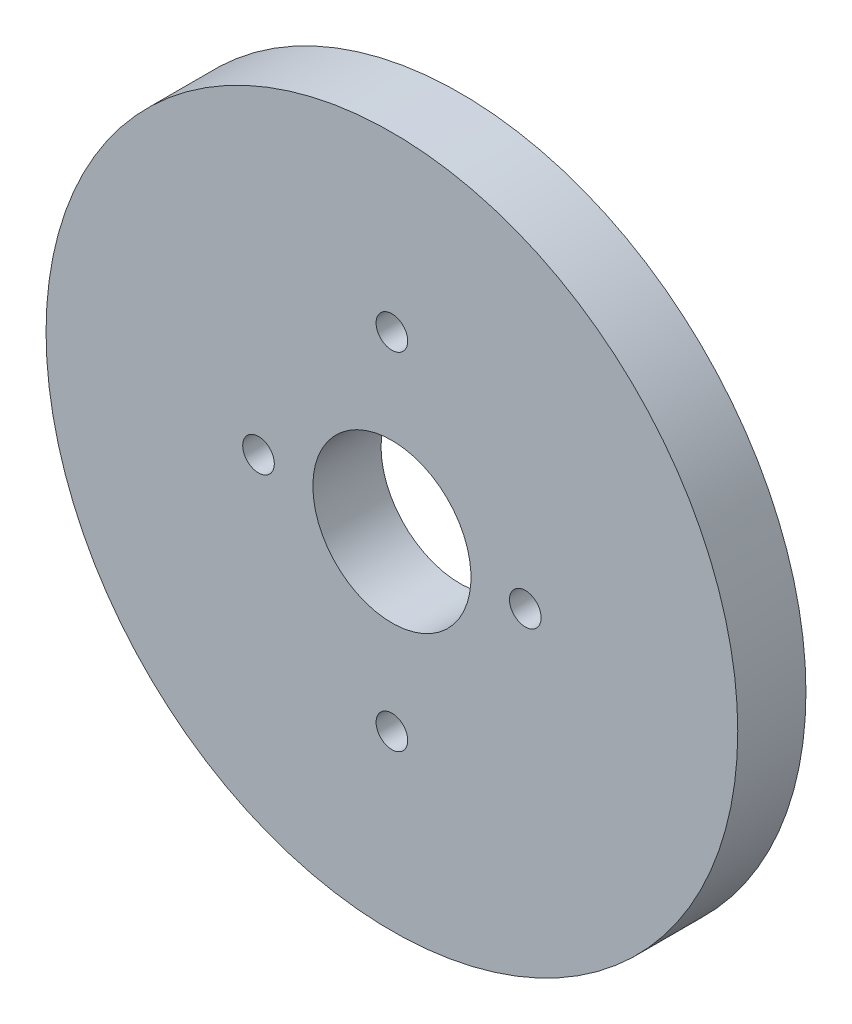
ISO-10303-21;
HEADER;
FILE_DESCRIPTION(('STEP AP214'),'2;1');
FILE_NAME('part.step','',(''),(''),'','','');
FILE_SCHEMA(('AUTOMOTIVE_DESIGN { 1 0 10303 214 1 1 1 1 }'));
ENDSEC;
DATA;
#1=APPLICATION_CONTEXT('core data for automotive mechanical design processes');
#2=APPLICATION_PROTOCOL_DEFINITION('international standard','automotive_design',2000,#1);
#3=PRODUCT_CONTEXT('',#1,'mechanical');
#4=PRODUCT('Part','Part','',(#3));
#5=PRODUCT_RELATED_PRODUCT_CATEGORY('part','',(#4));
#6=PRODUCT_DEFINITION_FORMATION('','',#4);
#7=PRODUCT_DEFINITION_CONTEXT('part definition',#1,'design');
#8=PRODUCT_DEFINITION('design','',#6,#7);
#9=PRODUCT_DEFINITION_SHAPE('','',#8);
#10=(LENGTH_UNIT() NAMED_UNIT(*) SI_UNIT(.MILLI.,.METRE.));
#11=(NAMED_UNIT(*) PLANE_ANGLE_UNIT() SI_UNIT($,.RADIAN.));
#12=(NAMED_UNIT(*) SI_UNIT($,.STERADIAN.) SOLID_ANGLE_UNIT());
#13=UNCERTAINTY_MEASURE_WITH_UNIT(LENGTH_MEASURE(1.E-05),#10,'distance_accuracy_value','');
#14=(GEOMETRIC_REPRESENTATION_CONTEXT(3) GLOBAL_UNCERTAINTY_ASSIGNED_CONTEXT((#13)) GLOBAL_UNIT_ASSIGNED_CONTEXT((#10,
#11,#12)) REPRESENTATION_CONTEXT('',''));
#15=CARTESIAN_POINT('',(0.,0.,0.));
#16=DIRECTION('',(0.,0.,1.));
#17=DIRECTION('',(1.,0.,0.));
#18=AXIS2_PLACEMENT_3D('',#15,#16,#17);
#19=CARTESIAN_POINT('',(0.,0.,3.45));
#20=DIRECTION('',(0.,0.,1.));
#21=DIRECTION('',(1.,0.,0.));
#22=AXIS2_PLACEMENT_3D('',#19,#20,#21);
#23=PLANE('',#22);
#24=CARTESIAN_POINT('',(0.,-8.75,3.45));
#25=DIRECTION('',(0.,0.,1.));
#26=DIRECTION('',(-1.,0.,0.));
#27=AXIS2_PLACEMENT_3D('',#24,#25,#26);
#28=CIRCLE('',#27,0.8);
#29=CARTESIAN_POINT('',(-0.8,-8.75,3.45));
#30=VERTEX_POINT('',#29);
#31=EDGE_CURVE('E58',#30,#30,#28,.T.);
#32=ORIENTED_EDGE('',*,*,#31,.F.);
#33=EDGE_LOOP('',(#32));
#34=FACE_BOUND('',#33,.T.);
#35=CARTESIAN_POINT('',(6.75,0.,3.45));
#36=DIRECTION('',(0.,0.,1.));
#37=DIRECTION('',(1.,0.,0.));
#38=AXIS2_PLACEMENT_3D('',#35,#36,#37);
#39=CIRCLE('',#38,0.8);
#40=CARTESIAN_POINT('',(5.95,0.,3.45));
#41=VERTEX_POINT('',#40);
#42=EDGE_CURVE('E46',#41,#41,#39,.T.);
#43=ORIENTED_EDGE('',*,*,#42,.F.);
#44=EDGE_LOOP('',(#43));
#45=FACE_BOUND('',#44,.T.);
#46=CARTESIAN_POINT('',(0.,0.,3.45));
#47=DIRECTION('',(0.,0.,1.));
#48=DIRECTION('',(1.,0.,0.));
#49=AXIS2_PLACEMENT_3D('',#46,#47,#48);
#50=CIRCLE('',#49,17.5);
#51=CARTESIAN_POINT('',(-17.5,0.,3.45));
#52=VERTEX_POINT('',#51);
#53=EDGE_CURVE('E10',#52,#52,#50,.T.);
#54=ORIENTED_EDGE('',*,*,#53,.T.);
#55=EDGE_LOOP('',(#54));
#56=FACE_BOUND('',#55,.T.);
#57=CARTESIAN_POINT('',(0.,0.,3.45));
#58=DIRECTION('',(0.,0.,1.));
#59=DIRECTION('',(1.,0.,0.));
#60=AXIS2_PLACEMENT_3D('',#57,#58,#59);
#61=CIRCLE('',#60,4.);
#62=CARTESIAN_POINT('',(-4.,0.,3.45));
#63=VERTEX_POINT('',#62);
#64=EDGE_CURVE('E41',#63,#63,#61,.T.);
#65=ORIENTED_EDGE('',*,*,#64,.F.);
#66=EDGE_LOOP('',(#65));
#67=FACE_BOUND('',#66,.T.);
#68=CARTESIAN_POINT('',(0.,8.75,3.45));
#69=DIRECTION('',(0.,0.,1.));
#70=DIRECTION('',(1.,0.,0.));
#71=AXIS2_PLACEMENT_3D('',#68,#69,#70);
#72=CIRCLE('',#71,0.8);
#73=CARTESIAN_POINT('',(-0.8,8.75,3.45));
#74=VERTEX_POINT('',#73);
#75=EDGE_CURVE('E52',#74,#74,#72,.T.);
#76=ORIENTED_EDGE('',*,*,#75,.F.);
#77=EDGE_LOOP('',(#76));
#78=FACE_BOUND('',#77,.T.);
#79=CARTESIAN_POINT('',(-6.75,0.,3.45));
#80=DIRECTION('',(0.,0.,1.));
#81=DIRECTION('',(-1.,0.,0.));
#82=AXIS2_PLACEMENT_3D('',#79,#80,#81);
#83=CIRCLE('',#82,0.8);
#84=CARTESIAN_POINT('',(-7.55,0.,3.45));
#85=VERTEX_POINT('',#84);
#86=EDGE_CURVE('E64',#85,#85,#83,.T.);
#87=ORIENTED_EDGE('',*,*,#86,.F.);
#88=EDGE_LOOP('',(#87));
#89=FACE_BOUND('',#88,.T.);
#90=ADVANCED_FACE('F30',(#34,#45,#56,#67,#78,#89),#23,.T.);
#91=CARTESIAN_POINT('',(0.,0.,0.));
#92=DIRECTION('',(0.,0.,1.));
#93=DIRECTION('',(1.,0.,0.));
#94=AXIS2_PLACEMENT_3D('',#91,#92,#93);
#95=PLANE('',#94);
#96=CARTESIAN_POINT('',(0.,0.,0.));
#97=DIRECTION('',(0.,0.,1.));
#98=DIRECTION('',(1.,0.,0.));
#99=AXIS2_PLACEMENT_3D('',#96,#97,#98);
#100=CIRCLE('',#99,17.5);
#101=CARTESIAN_POINT('',(-17.5,0.,0.));
#102=VERTEX_POINT('',#101);
#103=EDGE_CURVE('E34',#102,#102,#100,.T.);
#104=ORIENTED_EDGE('',*,*,#103,.F.);
#105=EDGE_LOOP('',(#104));
#106=FACE_BOUND('',#105,.T.);
#107=CARTESIAN_POINT('',(0.,0.,0.));
#108=DIRECTION('',(0.,0.,1.));
#109=DIRECTION('',(1.,0.,0.));
#110=AXIS2_PLACEMENT_3D('',#107,#108,#109);
#111=CIRCLE('',#110,4.);
#112=CARTESIAN_POINT('',(-4.,0.,0.));
#113=VERTEX_POINT('',#112);
#114=EDGE_CURVE('E43',#113,#113,#111,.T.);
#115=ORIENTED_EDGE('',*,*,#114,.T.);
#116=EDGE_LOOP('',(#115));
#117=FACE_BOUND('',#116,.T.);
#118=CARTESIAN_POINT('',(6.75,0.,0.));
#119=DIRECTION('',(0.,0.,1.));
#120=DIRECTION('',(1.,0.,0.));
#121=AXIS2_PLACEMENT_3D('',#118,#119,#120);
#122=CIRCLE('',#121,0.8);
#123=CARTESIAN_POINT('',(5.95,0.,0.));
#124=VERTEX_POINT('',#123);
#125=EDGE_CURVE('E49',#124,#124,#122,.T.);
#126=ORIENTED_EDGE('',*,*,#125,.T.);
#127=EDGE_LOOP('',(#126));
#128=FACE_BOUND('',#127,.T.);
#129=CARTESIAN_POINT('',(0.,8.75,0.));
#130=DIRECTION('',(0.,0.,1.));
#131=DIRECTION('',(1.,0.,0.));
#132=AXIS2_PLACEMENT_3D('',#129,#130,#131);
#133=CIRCLE('',#132,0.8);
#134=CARTESIAN_POINT('',(-0.8,8.75,0.));
#135=VERTEX_POINT('',#134);
#136=EDGE_CURVE('E55',#135,#135,#133,.T.);
#137=ORIENTED_EDGE('',*,*,#136,.T.);
#138=EDGE_LOOP('',(#137));
#139=FACE_BOUND('',#138,.T.);
#140=CARTESIAN_POINT('',(0.,-8.75,0.));
#141=DIRECTION('',(0.,0.,1.));
#142=DIRECTION('',(-1.,0.,0.));
#143=AXIS2_PLACEMENT_3D('',#140,#141,#142);
#144=CIRCLE('',#143,0.8);
#145=CARTESIAN_POINT('',(-0.8,-8.75,0.));
#146=VERTEX_POINT('',#145);
#147=EDGE_CURVE('E61',#146,#146,#144,.T.);
#148=ORIENTED_EDGE('',*,*,#147,.T.);
#149=EDGE_LOOP('',(#148));
#150=FACE_BOUND('',#149,.T.);
#151=CARTESIAN_POINT('',(-6.75,0.,0.));
#152=DIRECTION('',(0.,0.,1.));
#153=DIRECTION('',(-1.,0.,0.));
#154=AXIS2_PLACEMENT_3D('',#151,#152,#153);
#155=CIRCLE('',#154,0.8);
#156=CARTESIAN_POINT('',(-7.55,0.,0.));
#157=VERTEX_POINT('',#156);
#158=EDGE_CURVE('E67',#157,#157,#155,.T.);
#159=ORIENTED_EDGE('',*,*,#158,.T.);
#160=EDGE_LOOP('',(#159));
#161=FACE_BOUND('',#160,.T.);
#162=ADVANCED_FACE('F77',(#106,#117,#128,#139,#150,#161),#95,.F.);
#163=CARTESIAN_POINT('',(0.,0.,3.45));
#164=DIRECTION('',(0.,0.,-1.));
#165=DIRECTION('',(-1.,0.,0.));
#166=AXIS2_PLACEMENT_3D('',#163,#164,#165);
#167=CYLINDRICAL_SURFACE('',#166,17.5);
#168=CARTESIAN_POINT('',(-17.5,0.,3.45));
#169=CARTESIAN_POINT('',(-17.5,0.,3.4140625));
#170=CARTESIAN_POINT('',(-17.5,0.,3.378125));
#171=CARTESIAN_POINT('',(-17.5,0.,3.30625));
#172=CARTESIAN_POINT('',(-17.5,0.,3.2703125));
#173=CARTESIAN_POINT('',(-17.5,0.,3.1984375));
#174=CARTESIAN_POINT('',(-17.5,0.,3.1625));
#175=CARTESIAN_POINT('',(-17.5,0.,3.090625));
#176=CARTESIAN_POINT('',(-17.5,0.,3.0546875));
#177=CARTESIAN_POINT('',(-17.5,0.,2.9828125));
#178=CARTESIAN_POINT('',(-17.5,0.,2.946875));
#179=CARTESIAN_POINT('',(-17.5,0.,2.875));
#180=CARTESIAN_POINT('',(-17.5,0.,2.8390625));
#181=CARTESIAN_POINT('',(-17.5,0.,2.7671875));
#182=CARTESIAN_POINT('',(-17.5,0.,2.73125));
#183=CARTESIAN_POINT('',(-17.5,0.,2.659375));
#184=CARTESIAN_POINT('',(-17.5,0.,2.6234375));
#185=CARTESIAN_POINT('',(-17.5,0.,2.5515625));
#186=CARTESIAN_POINT('',(-17.5,0.,2.515625));
#187=CARTESIAN_POINT('',(-17.5,0.,2.44375));
#188=CARTESIAN_POINT('',(-17.5,0.,2.4078125));
#189=CARTESIAN_POINT('',(-17.5,0.,2.3359375));
#190=CARTESIAN_POINT('',(-17.5,0.,2.3));
#191=CARTESIAN_POINT('',(-17.5,0.,2.228125));
#192=CARTESIAN_POINT('',(-17.5,0.,2.1921875));
#193=CARTESIAN_POINT('',(-17.5,0.,2.1203125));
#194=CARTESIAN_POINT('',(-17.5,0.,2.084375));
#195=CARTESIAN_POINT('',(-17.5,0.,2.0125));
#196=CARTESIAN_POINT('',(-17.5,0.,1.9765625));
#197=CARTESIAN_POINT('',(-17.5,0.,1.9046875));
#198=CARTESIAN_POINT('',(-17.5,0.,1.86875));
#199=CARTESIAN_POINT('',(-17.5,0.,1.796875));
#200=CARTESIAN_POINT('',(-17.5,0.,1.7609375));
#201=CARTESIAN_POINT('',(-17.5,0.,1.6890625));
#202=CARTESIAN_POINT('',(-17.5,0.,1.653125));
#203=CARTESIAN_POINT('',(-17.5,0.,1.58125));
#204=CARTESIAN_POINT('',(-17.5,0.,1.5453125));
#205=CARTESIAN_POINT('',(-17.5,0.,1.4734375));
#206=CARTESIAN_POINT('',(-17.5,0.,1.4375));
#207=CARTESIAN_POINT('',(-17.5,0.,1.365625));
#208=CARTESIAN_POINT('',(-17.5,0.,1.3296875));
#209=CARTESIAN_POINT('',(-17.5,0.,1.2578125));
#210=CARTESIAN_POINT('',(-17.5,0.,1.221875));
#211=CARTESIAN_POINT('',(-17.5,0.,1.15));
#212=CARTESIAN_POINT('',(-17.5,0.,1.1140625));
#213=CARTESIAN_POINT('',(-17.5,0.,1.0421875));
#214=CARTESIAN_POINT('',(-17.5,0.,1.00625));
#215=CARTESIAN_POINT('',(-17.5,0.,0.934375));
#216=CARTESIAN_POINT('',(-17.5,0.,0.8984375));
#217=CARTESIAN_POINT('',(-17.5,0.,0.8265625));
#218=CARTESIAN_POINT('',(-17.5,0.,0.790625));
#219=CARTESIAN_POINT('',(-17.5,0.,0.71875));
#220=CARTESIAN_POINT('',(-17.5,0.,0.6828125));
#221=CARTESIAN_POINT('',(-17.5,0.,0.6109375));
#222=CARTESIAN_POINT('',(-17.5,0.,0.575));
#223=CARTESIAN_POINT('',(-17.5,0.,0.503125));
#224=CARTESIAN_POINT('',(-17.5,0.,0.4671875));
#225=CARTESIAN_POINT('',(-17.5,0.,0.3953125));
#226=CARTESIAN_POINT('',(-17.5,0.,0.359375));
#227=CARTESIAN_POINT('',(-17.5,0.,0.2875));
#228=CARTESIAN_POINT('',(-17.5,0.,0.2515625));
#229=CARTESIAN_POINT('',(-17.5,0.,0.1796875));
#230=CARTESIAN_POINT('',(-17.5,0.,0.14375));
#231=CARTESIAN_POINT('',(-17.5,0.,0.0718749999999999));
#232=CARTESIAN_POINT('',(-17.5,0.,0.0359374999999999));
#233=CARTESIAN_POINT('',(-17.5,0.,0.));
#234=B_SPLINE_CURVE_WITH_KNOTS('',3,(#168,#169,#170,#171,#172,#173,#174,#175,#176,#177,#178,
#179,#180,#181,#182,#183,#184,#185,#186,#187,#188,#189,#190,#191,#192,#193,#194,#195,#196,#197,
#198,#199,#200,#201,#202,#203,#204,#205,#206,#207,#208,#209,#210,#211,#212,#213,#214,#215,#216,
#217,#218,#219,#220,#221,#222,#223,#224,#225,#226,#227,#228,#229,#230,#231,#232,#233),
.UNSPECIFIED.,.F.,.F.,(4,2,2,2,2,2,2,2,2,2,2,2,2,2,2,2,2,2,2,2,2,2,2,2,2,2,2,2,2,2,2,2,4),(0.,
0.1078125,0.215625,0.3234375,0.43125,0.5390625,0.646875,0.7546875,0.8625,0.9703125,1.078125,
1.1859375,1.29375,1.4015625,1.509375,1.6171875,1.725,1.8328125,1.940625,2.0484375,2.15625,
2.2640625,2.371875,2.4796875,2.5875,2.6953125,2.803125,2.9109375,3.01875,3.1265625,3.234375,
3.3421875,3.45),.UNSPECIFIED.);
#235=EDGE_CURVE('BSEAM32',#52,#102,#234,.T.);
#236=ORIENTED_EDGE('',*,*,#53,.F.);
#237=ORIENTED_EDGE('',*,*,#103,.T.);
#238=ORIENTED_EDGE('',*,*,#235,.T.);
#239=ORIENTED_EDGE('',*,*,#235,.F.);
#240=EDGE_LOOP('',(#236,#238,#237,#239));
#241=FACE_BOUND('',#240,.T.);
#242=ADVANCED_FACE('F32',(#241),#167,.T.);
#243=CARTESIAN_POINT('',(0.,0.,3.45));
#244=DIRECTION('',(0.,0.,-1.));
#245=DIRECTION('',(-1.,0.,0.));
#246=AXIS2_PLACEMENT_3D('',#243,#244,#245);
#247=CYLINDRICAL_SURFACE('',#246,4.);
#248=CARTESIAN_POINT('',(-4.,0.,3.45));
#249=CARTESIAN_POINT('',(-4.,0.,3.4140625));
#250=CARTESIAN_POINT('',(-4.,0.,3.378125));
#251=CARTESIAN_POINT('',(-4.,0.,3.30625));
#252=CARTESIAN_POINT('',(-4.,0.,3.2703125));
#253=CARTESIAN_POINT('',(-4.,0.,3.1984375));
#254=CARTESIAN_POINT('',(-4.,0.,3.1625));
#255=CARTESIAN_POINT('',(-4.,0.,3.090625));
#256=CARTESIAN_POINT('',(-4.,0.,3.0546875));
#257=CARTESIAN_POINT('',(-4.,0.,2.9828125));
#258=CARTESIAN_POINT('',(-4.,0.,2.946875));
#259=CARTESIAN_POINT('',(-4.,0.,2.875));
#260=CARTESIAN_POINT('',(-4.,0.,2.8390625));
#261=CARTESIAN_POINT('',(-4.,0.,2.7671875));
#262=CARTESIAN_POINT('',(-4.,0.,2.73125));
#263=CARTESIAN_POINT('',(-4.,0.,2.659375));
#264=CARTESIAN_POINT('',(-4.,0.,2.6234375));
#265=CARTESIAN_POINT('',(-4.,0.,2.5515625));
#266=CARTESIAN_POINT('',(-4.,0.,2.515625));
#267=CARTESIAN_POINT('',(-4.,0.,2.44375));
#268=CARTESIAN_POINT('',(-4.,0.,2.4078125));
#269=CARTESIAN_POINT('',(-4.,0.,2.3359375));
#270=CARTESIAN_POINT('',(-4.,0.,2.3));
#271=CARTESIAN_POINT('',(-4.,0.,2.228125));
#272=CARTESIAN_POINT('',(-4.,0.,2.1921875));
#273=CARTESIAN_POINT('',(-4.,0.,2.1203125));
#274=CARTESIAN_POINT('',(-4.,0.,2.084375));
#275=CARTESIAN_POINT('',(-4.,0.,2.0125));
#276=CARTESIAN_POINT('',(-4.,0.,1.9765625));
#277=CARTESIAN_POINT('',(-4.,0.,1.9046875));
#278=CARTESIAN_POINT('',(-4.,0.,1.86875));
#279=CARTESIAN_POINT('',(-4.,0.,1.796875));
#280=CARTESIAN_POINT('',(-4.,0.,1.7609375));
#281=CARTESIAN_POINT('',(-4.,0.,1.6890625));
#282=CARTESIAN_POINT('',(-4.,0.,1.653125));
#283=CARTESIAN_POINT('',(-4.,0.,1.58125));
#284=CARTESIAN_POINT('',(-4.,0.,1.5453125));
#285=CARTESIAN_POINT('',(-4.,0.,1.4734375));
#286=CARTESIAN_POINT('',(-4.,0.,1.4375));
#287=CARTESIAN_POINT('',(-4.,0.,1.365625));
#288=CARTESIAN_POINT('',(-4.,0.,1.3296875));
#289=CARTESIAN_POINT('',(-4.,0.,1.2578125));
#290=CARTESIAN_POINT('',(-4.,0.,1.221875));
#291=CARTESIAN_POINT('',(-4.,0.,1.15));
#292=CARTESIAN_POINT('',(-4.,0.,1.1140625));
#293=CARTESIAN_POINT('',(-4.,0.,1.0421875));
#294=CARTESIAN_POINT('',(-4.,0.,1.00625));
#295=CARTESIAN_POINT('',(-4.,0.,0.934375));
#296=CARTESIAN_POINT('',(-4.,0.,0.8984375));
#297=CARTESIAN_POINT('',(-4.,0.,0.8265625));
#298=CARTESIAN_POINT('',(-4.,0.,0.790625));
#299=CARTESIAN_POINT('',(-4.,0.,0.71875));
#300=CARTESIAN_POINT('',(-4.,0.,0.6828125));
#301=CARTESIAN_POINT('',(-4.,0.,0.6109375));
#302=CARTESIAN_POINT('',(-4.,0.,0.575));
#303=CARTESIAN_POINT('',(-4.,0.,0.503125));
#304=CARTESIAN_POINT('',(-4.,0.,0.4671875));
#305=CARTESIAN_POINT('',(-4.,0.,0.3953125));
#306=CARTESIAN_POINT('',(-4.,0.,0.359375));
#307=CARTESIAN_POINT('',(-4.,0.,0.2875));
#308=CARTESIAN_POINT('',(-4.,0.,0.2515625));
#309=CARTESIAN_POINT('',(-4.,0.,0.1796875));
#310=CARTESIAN_POINT('',(-4.,0.,0.14375));
#311=CARTESIAN_POINT('',(-4.,0.,0.0718749999999999));
#312=CARTESIAN_POINT('',(-4.,0.,0.0359374999999999));
#313=CARTESIAN_POINT('',(-4.,0.,0.));
#314=B_SPLINE_CURVE_WITH_KNOTS('',3,(#248,#249,#250,#251,#252,#253,#254,#255,#256,#257,#258,
#259,#260,#261,#262,#263,#264,#265,#266,#267,#268,#269,#270,#271,#272,#273,#274,#275,#276,#277,
#278,#279,#280,#281,#282,#283,#284,#285,#286,#287,#288,#289,#290,#291,#292,#293,#294,#295,#296,
#297,#298,#299,#300,#301,#302,#303,#304,#305,#306,#307,#308,#309,#310,#311,#312,#313),
.UNSPECIFIED.,.F.,.F.,(4,2,2,2,2,2,2,2,2,2,2,2,2,2,2,2,2,2,2,2,2,2,2,2,2,2,2,2,2,2,2,2,4),(0.,
0.1078125,0.215625,0.3234375,0.43125,0.5390625,0.646875,0.7546875,0.8625,0.9703125,1.078125,
1.1859375,1.29375,1.4015625,1.509375,1.6171875,1.725,1.8328125,1.940625,2.0484375,2.15625,
2.2640625,2.371875,2.4796875,2.5875,2.6953125,2.803125,2.9109375,3.01875,3.1265625,3.234375,
3.3421875,3.45),.UNSPECIFIED.);
#315=EDGE_CURVE('BSEAM87',#63,#113,#314,.T.);
#316=ORIENTED_EDGE('',*,*,#64,.T.);
#317=ORIENTED_EDGE('',*,*,#114,.F.);
#318=ORIENTED_EDGE('',*,*,#315,.T.);
#319=ORIENTED_EDGE('',*,*,#315,.F.);
#320=EDGE_LOOP('',(#316,#318,#317,#319));
#321=FACE_BOUND('',#320,.T.);
#322=ADVANCED_FACE('F87',(#321),#247,.F.);
#323=CARTESIAN_POINT('',(6.75,0.,3.45));
#324=DIRECTION('',(0.,0.,-1.));
#325=DIRECTION('',(-1.,0.,0.));
#326=AXIS2_PLACEMENT_3D('',#323,#324,#325);
#327=CYLINDRICAL_SURFACE('',#326,0.8);
#328=CARTESIAN_POINT('',(5.95,0.,3.45));
#329=CARTESIAN_POINT('',(5.95,0.,3.4140625));
#330=CARTESIAN_POINT('',(5.95,0.,3.378125));
#331=CARTESIAN_POINT('',(5.95,0.,3.30625));
#332=CARTESIAN_POINT('',(5.95,0.,3.2703125));
#333=CARTESIAN_POINT('',(5.95,0.,3.1984375));
#334=CARTESIAN_POINT('',(5.95,0.,3.1625));
#335=CARTESIAN_POINT('',(5.95,0.,3.090625));
#336=CARTESIAN_POINT('',(5.95,0.,3.0546875));
#337=CARTESIAN_POINT('',(5.95,0.,2.9828125));
#338=CARTESIAN_POINT('',(5.95,0.,2.946875));
#339=CARTESIAN_POINT('',(5.95,0.,2.875));
#340=CARTESIAN_POINT('',(5.95,0.,2.8390625));
#341=CARTESIAN_POINT('',(5.95,0.,2.7671875));
#342=CARTESIAN_POINT('',(5.95,0.,2.73125));
#343=CARTESIAN_POINT('',(5.95,0.,2.659375));
#344=CARTESIAN_POINT('',(5.95,0.,2.6234375));
#345=CARTESIAN_POINT('',(5.95,0.,2.5515625));
#346=CARTESIAN_POINT('',(5.95,0.,2.515625));
#347=CARTESIAN_POINT('',(5.95,0.,2.44375));
#348=CARTESIAN_POINT('',(5.95,0.,2.4078125));
#349=CARTESIAN_POINT('',(5.95,0.,2.3359375));
#350=CARTESIAN_POINT('',(5.95,0.,2.3));
#351=CARTESIAN_POINT('',(5.95,0.,2.228125));
#352=CARTESIAN_POINT('',(5.95,0.,2.1921875));
#353=CARTESIAN_POINT('',(5.95,0.,2.1203125));
#354=CARTESIAN_POINT('',(5.95,0.,2.084375));
#355=CARTESIAN_POINT('',(5.95,0.,2.0125));
#356=CARTESIAN_POINT('',(5.95,0.,1.9765625));
#357=CARTESIAN_POINT('',(5.95,0.,1.9046875));
#358=CARTESIAN_POINT('',(5.95,0.,1.86875));
#359=CARTESIAN_POINT('',(5.95,0.,1.796875));
#360=CARTESIAN_POINT('',(5.95,0.,1.7609375));
#361=CARTESIAN_POINT('',(5.95,0.,1.6890625));
#362=CARTESIAN_POINT('',(5.95,0.,1.653125));
#363=CARTESIAN_POINT('',(5.95,0.,1.58125));
#364=CARTESIAN_POINT('',(5.95,0.,1.5453125));
#365=CARTESIAN_POINT('',(5.95,0.,1.4734375));
#366=CARTESIAN_POINT('',(5.95,0.,1.4375));
#367=CARTESIAN_POINT('',(5.95,0.,1.365625));
#368=CARTESIAN_POINT('',(5.95,0.,1.3296875));
#369=CARTESIAN_POINT('',(5.95,0.,1.2578125));
#370=CARTESIAN_POINT('',(5.95,0.,1.221875));
#371=CARTESIAN_POINT('',(5.95,0.,1.15));
#372=CARTESIAN_POINT('',(5.95,0.,1.1140625));
#373=CARTESIAN_POINT('',(5.95,0.,1.0421875));
#374=CARTESIAN_POINT('',(5.95,0.,1.00625));
#375=CARTESIAN_POINT('',(5.95,0.,0.934375));
#376=CARTESIAN_POINT('',(5.95,0.,0.8984375));
#377=CARTESIAN_POINT('',(5.95,0.,0.8265625));
#378=CARTESIAN_POINT('',(5.95,0.,0.790625));
#379=CARTESIAN_POINT('',(5.95,0.,0.71875));
#380=CARTESIAN_POINT('',(5.95,0.,0.6828125));
#381=CARTESIAN_POINT('',(5.95,0.,0.6109375));
#382=CARTESIAN_POINT('',(5.95,0.,0.575));
#383=CARTESIAN_POINT('',(5.95,0.,0.503125));
#384=CARTESIAN_POINT('',(5.95,0.,0.4671875));
#385=CARTESIAN_POINT('',(5.95,0.,0.3953125));
#386=CARTESIAN_POINT('',(5.95,0.,0.359375));
#387=CARTESIAN_POINT('',(5.95,0.,0.2875));
#388=CARTESIAN_POINT('',(5.95,0.,0.2515625));
#389=CARTESIAN_POINT('',(5.95,0.,0.1796875));
#390=CARTESIAN_POINT('',(5.95,0.,0.14375));
#391=CARTESIAN_POINT('',(5.95,0.,0.0718749999999999));
#392=CARTESIAN_POINT('',(5.95,0.,0.0359374999999999));
#393=CARTESIAN_POINT('',(5.95,0.,0.));
#394=B_SPLINE_CURVE_WITH_KNOTS('',3,(#328,#329,#330,#331,#332,#333,#334,#335,#336,#337,#338,
#339,#340,#341,#342,#343,#344,#345,#346,#347,#348,#349,#350,#351,#352,#353,#354,#355,#356,#357,
#358,#359,#360,#361,#362,#363,#364,#365,#366,#367,#368,#369,#370,#371,#372,#373,#374,#375,#376,
#377,#378,#379,#380,#381,#382,#383,#384,#385,#386,#387,#388,#389,#390,#391,#392,#393),
.UNSPECIFIED.,.F.,.F.,(4,2,2,2,2,2,2,2,2,2,2,2,2,2,2,2,2,2,2,2,2,2,2,2,2,2,2,2,2,2,2,2,4),(0.,
0.1078125,0.215625,0.3234375,0.43125,0.5390625,0.646875,0.7546875,0.8625,0.9703125,1.078125,
1.1859375,1.29375,1.4015625,1.509375,1.6171875,1.725,1.8328125,1.940625,2.0484375,2.15625,
2.2640625,2.371875,2.4796875,2.5875,2.6953125,2.803125,2.9109375,3.01875,3.1265625,3.234375,
3.3421875,3.45),.UNSPECIFIED.);
#395=EDGE_CURVE('BSEAM90',#41,#124,#394,.T.);
#396=ORIENTED_EDGE('',*,*,#42,.T.);
#397=ORIENTED_EDGE('',*,*,#125,.F.);
#398=ORIENTED_EDGE('',*,*,#395,.T.);
#399=ORIENTED_EDGE('',*,*,#395,.F.);
#400=EDGE_LOOP('',(#396,#398,#397,#399));
#401=FACE_BOUND('',#400,.T.);
#402=ADVANCED_FACE('F90',(#401),#327,.F.);
#403=CARTESIAN_POINT('',(0.,8.75,3.45));
#404=DIRECTION('',(0.,0.,-1.));
#405=DIRECTION('',(-1.,0.,0.));
#406=AXIS2_PLACEMENT_3D('',#403,#404,#405);
#407=CYLINDRICAL_SURFACE('',#406,0.8);
#408=CARTESIAN_POINT('',(-0.8,8.75,3.45));
#409=CARTESIAN_POINT('',(-0.8,8.75,3.4140625));
#410=CARTESIAN_POINT('',(-0.8,8.75,3.378125));
#411=CARTESIAN_POINT('',(-0.8,8.75,3.30625));
#412=CARTESIAN_POINT('',(-0.8,8.75,3.2703125));
#413=CARTESIAN_POINT('',(-0.8,8.75,3.1984375));
#414=CARTESIAN_POINT('',(-0.8,8.75,3.1625));
#415=CARTESIAN_POINT('',(-0.8,8.75,3.090625));
#416=CARTESIAN_POINT('',(-0.8,8.75,3.0546875));
#417=CARTESIAN_POINT('',(-0.8,8.75,2.9828125));
#418=CARTESIAN_POINT('',(-0.8,8.75,2.946875));
#419=CARTESIAN_POINT('',(-0.8,8.75,2.875));
#420=CARTESIAN_POINT('',(-0.8,8.75,2.8390625));
#421=CARTESIAN_POINT('',(-0.8,8.75,2.7671875));
#422=CARTESIAN_POINT('',(-0.8,8.75,2.73125));
#423=CARTESIAN_POINT('',(-0.8,8.75,2.659375));
#424=CARTESIAN_POINT('',(-0.8,8.75,2.6234375));
#425=CARTESIAN_POINT('',(-0.8,8.75,2.5515625));
#426=CARTESIAN_POINT('',(-0.8,8.75,2.515625));
#427=CARTESIAN_POINT('',(-0.8,8.75,2.44375));
#428=CARTESIAN_POINT('',(-0.8,8.75,2.4078125));
#429=CARTESIAN_POINT('',(-0.8,8.75,2.3359375));
#430=CARTESIAN_POINT('',(-0.8,8.75,2.3));
#431=CARTESIAN_POINT('',(-0.8,8.75,2.228125));
#432=CARTESIAN_POINT('',(-0.8,8.75,2.1921875));
#433=CARTESIAN_POINT('',(-0.8,8.75,2.1203125));
#434=CARTESIAN_POINT('',(-0.8,8.75,2.084375));
#435=CARTESIAN_POINT('',(-0.8,8.75,2.0125));
#436=CARTESIAN_POINT('',(-0.8,8.75,1.9765625));
#437=CARTESIAN_POINT('',(-0.8,8.75,1.9046875));
#438=CARTESIAN_POINT('',(-0.8,8.75,1.86875));
#439=CARTESIAN_POINT('',(-0.8,8.75,1.796875));
#440=CARTESIAN_POINT('',(-0.8,8.75,1.7609375));
#441=CARTESIAN_POINT('',(-0.8,8.75,1.6890625));
#442=CARTESIAN_POINT('',(-0.8,8.75,1.653125));
#443=CARTESIAN_POINT('',(-0.8,8.75,1.58125));
#444=CARTESIAN_POINT('',(-0.8,8.75,1.5453125));
#445=CARTESIAN_POINT('',(-0.8,8.75,1.4734375));
#446=CARTESIAN_POINT('',(-0.8,8.75,1.4375));
#447=CARTESIAN_POINT('',(-0.8,8.75,1.365625));
#448=CARTESIAN_POINT('',(-0.8,8.75,1.3296875));
#449=CARTESIAN_POINT('',(-0.8,8.75,1.2578125));
#450=CARTESIAN_POINT('',(-0.8,8.75,1.221875));
#451=CARTESIAN_POINT('',(-0.8,8.75,1.15));
#452=CARTESIAN_POINT('',(-0.8,8.75,1.1140625));
#453=CARTESIAN_POINT('',(-0.8,8.75,1.0421875));
#454=CARTESIAN_POINT('',(-0.8,8.75,1.00625));
#455=CARTESIAN_POINT('',(-0.8,8.75,0.934375));
#456=CARTESIAN_POINT('',(-0.8,8.75,0.8984375));
#457=CARTESIAN_POINT('',(-0.8,8.75,0.8265625));
#458=CARTESIAN_POINT('',(-0.8,8.75,0.790625));
#459=CARTESIAN_POINT('',(-0.8,8.75,0.71875));
#460=CARTESIAN_POINT('',(-0.8,8.75,0.6828125));
#461=CARTESIAN_POINT('',(-0.8,8.75,0.6109375));
#462=CARTESIAN_POINT('',(-0.8,8.75,0.575));
#463=CARTESIAN_POINT('',(-0.8,8.75,0.503125));
#464=CARTESIAN_POINT('',(-0.8,8.75,0.4671875));
#465=CARTESIAN_POINT('',(-0.8,8.75,0.3953125));
#466=CARTESIAN_POINT('',(-0.8,8.75,0.359375));
#467=CARTESIAN_POINT('',(-0.8,8.75,0.2875));
#468=CARTESIAN_POINT('',(-0.8,8.75,0.2515625));
#469=CARTESIAN_POINT('',(-0.8,8.75,0.1796875));
#470=CARTESIAN_POINT('',(-0.8,8.75,0.14375));
#471=CARTESIAN_POINT('',(-0.8,8.75,0.0718749999999999));
#472=CARTESIAN_POINT('',(-0.8,8.75,0.0359374999999999));
#473=CARTESIAN_POINT('',(-0.8,8.75,0.));
#474=B_SPLINE_CURVE_WITH_KNOTS('',3,(#408,#409,#410,#411,#412,#413,#414,#415,#416,#417,#418,
#419,#420,#421,#422,#423,#424,#425,#426,#427,#428,#429,#430,#431,#432,#433,#434,#435,#436,#437,
#438,#439,#440,#441,#442,#443,#444,#445,#446,#447,#448,#449,#450,#451,#452,#453,#454,#455,#456,
#457,#458,#459,#460,#461,#462,#463,#464,#465,#466,#467,#468,#469,#470,#471,#472,#473),
.UNSPECIFIED.,.F.,.F.,(4,2,2,2,2,2,2,2,2,2,2,2,2,2,2,2,2,2,2,2,2,2,2,2,2,2,2,2,2,2,2,2,4),(0.,
0.1078125,0.215625,0.3234375,0.43125,0.5390625,0.646875,0.7546875,0.8625,0.9703125,1.078125,
1.1859375,1.29375,1.4015625,1.509375,1.6171875,1.725,1.8328125,1.940625,2.0484375,2.15625,
2.2640625,2.371875,2.4796875,2.5875,2.6953125,2.803125,2.9109375,3.01875,3.1265625,3.234375,
3.3421875,3.45),.UNSPECIFIED.);
#475=EDGE_CURVE('BSEAM94',#74,#135,#474,.T.);
#476=ORIENTED_EDGE('',*,*,#75,.T.);
#477=ORIENTED_EDGE('',*,*,#136,.F.);
#478=ORIENTED_EDGE('',*,*,#475,.T.);
#479=ORIENTED_EDGE('',*,*,#475,.F.);
#480=EDGE_LOOP('',(#476,#478,#477,#479));
#481=FACE_BOUND('',#480,.T.);
#482=ADVANCED_FACE('F94',(#481),#407,.F.);
#483=CARTESIAN_POINT('',(0.,-8.75,3.45));
#484=DIRECTION('',(0.,0.,-1.));
#485=DIRECTION('',(-1.,0.,0.));
#486=AXIS2_PLACEMENT_3D('',#483,#484,#485);
#487=CYLINDRICAL_SURFACE('',#486,0.8);
#488=CARTESIAN_POINT('',(-0.8,-8.75,3.45));
#489=CARTESIAN_POINT('',(-0.8,-8.75,3.4140625));
#490=CARTESIAN_POINT('',(-0.8,-8.75,3.378125));
#491=CARTESIAN_POINT('',(-0.8,-8.75,3.30625));
#492=CARTESIAN_POINT('',(-0.8,-8.75,3.2703125));
#493=CARTESIAN_POINT('',(-0.8,-8.75,3.1984375));
#494=CARTESIAN_POINT('',(-0.8,-8.75,3.1625));
#495=CARTESIAN_POINT('',(-0.8,-8.75,3.090625));
#496=CARTESIAN_POINT('',(-0.8,-8.75,3.0546875));
#497=CARTESIAN_POINT('',(-0.8,-8.75,2.9828125));
#498=CARTESIAN_POINT('',(-0.8,-8.75,2.946875));
#499=CARTESIAN_POINT('',(-0.8,-8.75,2.875));
#500=CARTESIAN_POINT('',(-0.8,-8.75,2.8390625));
#501=CARTESIAN_POINT('',(-0.8,-8.75,2.7671875));
#502=CARTESIAN_POINT('',(-0.8,-8.75,2.73125));
#503=CARTESIAN_POINT('',(-0.8,-8.75,2.659375));
#504=CARTESIAN_POINT('',(-0.8,-8.75,2.6234375));
#505=CARTESIAN_POINT('',(-0.8,-8.75,2.5515625));
#506=CARTESIAN_POINT('',(-0.8,-8.75,2.515625));
#507=CARTESIAN_POINT('',(-0.8,-8.75,2.44375));
#508=CARTESIAN_POINT('',(-0.8,-8.75,2.4078125));
#509=CARTESIAN_POINT('',(-0.8,-8.75,2.3359375));
#510=CARTESIAN_POINT('',(-0.8,-8.75,2.3));
#511=CARTESIAN_POINT('',(-0.8,-8.75,2.228125));
#512=CARTESIAN_POINT('',(-0.8,-8.75,2.1921875));
#513=CARTESIAN_POINT('',(-0.8,-8.75,2.1203125));
#514=CARTESIAN_POINT('',(-0.8,-8.75,2.084375));
#515=CARTESIAN_POINT('',(-0.8,-8.75,2.0125));
#516=CARTESIAN_POINT('',(-0.8,-8.75,1.9765625));
#517=CARTESIAN_POINT('',(-0.8,-8.75,1.9046875));
#518=CARTESIAN_POINT('',(-0.8,-8.75,1.86875));
#519=CARTESIAN_POINT('',(-0.8,-8.75,1.796875));
#520=CARTESIAN_POINT('',(-0.8,-8.75,1.7609375));
#521=CARTESIAN_POINT('',(-0.8,-8.75,1.6890625));
#522=CARTESIAN_POINT('',(-0.8,-8.75,1.653125));
#523=CARTESIAN_POINT('',(-0.8,-8.75,1.58125));
#524=CARTESIAN_POINT('',(-0.8,-8.75,1.5453125));
#525=CARTESIAN_POINT('',(-0.8,-8.75,1.4734375));
#526=CARTESIAN_POINT('',(-0.8,-8.75,1.4375));
#527=CARTESIAN_POINT('',(-0.8,-8.75,1.365625));
#528=CARTESIAN_POINT('',(-0.8,-8.75,1.3296875));
#529=CARTESIAN_POINT('',(-0.8,-8.75,1.2578125));
#530=CARTESIAN_POINT('',(-0.8,-8.75,1.221875));
#531=CARTESIAN_POINT('',(-0.8,-8.75,1.15));
#532=CARTESIAN_POINT('',(-0.8,-8.75,1.1140625));
#533=CARTESIAN_POINT('',(-0.8,-8.75,1.0421875));
#534=CARTESIAN_POINT('',(-0.8,-8.75,1.00625));
#535=CARTESIAN_POINT('',(-0.8,-8.75,0.934375));
#536=CARTESIAN_POINT('',(-0.8,-8.75,0.8984375));
#537=CARTESIAN_POINT('',(-0.8,-8.75,0.8265625));
#538=CARTESIAN_POINT('',(-0.8,-8.75,0.790625));
#539=CARTESIAN_POINT('',(-0.8,-8.75,0.71875));
#540=CARTESIAN_POINT('',(-0.8,-8.75,0.6828125));
#541=CARTESIAN_POINT('',(-0.8,-8.75,0.6109375));
#542=CARTESIAN_POINT('',(-0.8,-8.75,0.575));
#543=CARTESIAN_POINT('',(-0.8,-8.75,0.503125));
#544=CARTESIAN_POINT('',(-0.8,-8.75,0.4671875));
#545=CARTESIAN_POINT('',(-0.8,-8.75,0.3953125));
#546=CARTESIAN_POINT('',(-0.8,-8.75,0.359375));
#547=CARTESIAN_POINT('',(-0.8,-8.75,0.2875));
#548=CARTESIAN_POINT('',(-0.8,-8.75,0.2515625));
#549=CARTESIAN_POINT('',(-0.8,-8.75,0.1796875));
#550=CARTESIAN_POINT('',(-0.8,-8.75,0.14375));
#551=CARTESIAN_POINT('',(-0.8,-8.75,0.0718749999999999));
#552=CARTESIAN_POINT('',(-0.8,-8.75,0.0359374999999999));
#553=CARTESIAN_POINT('',(-0.8,-8.75,0.));
#554=B_SPLINE_CURVE_WITH_KNOTS('',3,(#488,#489,#490,#491,#492,#493,#494,#495,#496,#497,#498,
#499,#500,#501,#502,#503,#504,#505,#506,#507,#508,#509,#510,#511,#512,#513,#514,#515,#516,#517,
#518,#519,#520,#521,#522,#523,#524,#525,#526,#527,#528,#529,#530,#531,#532,#533,#534,#535,#536,
#537,#538,#539,#540,#541,#542,#543,#544,#545,#546,#547,#548,#549,#550,#551,#552,#553),
.UNSPECIFIED.,.F.,.F.,(4,2,2,2,2,2,2,2,2,2,2,2,2,2,2,2,2,2,2,2,2,2,2,2,2,2,2,2,2,2,2,2,4),(0.,
0.1078125,0.215625,0.3234375,0.43125,0.5390625,0.646875,0.7546875,0.8625,0.9703125,1.078125,
1.1859375,1.29375,1.4015625,1.509375,1.6171875,1.725,1.8328125,1.940625,2.0484375,2.15625,
2.2640625,2.371875,2.4796875,2.5875,2.6953125,2.803125,2.9109375,3.01875,3.1265625,3.234375,
3.3421875,3.45),.UNSPECIFIED.);
#555=EDGE_CURVE('BSEAM98',#30,#146,#554,.T.);
#556=ORIENTED_EDGE('',*,*,#31,.T.);
#557=ORIENTED_EDGE('',*,*,#147,.F.);
#558=ORIENTED_EDGE('',*,*,#555,.T.);
#559=ORIENTED_EDGE('',*,*,#555,.F.);
#560=EDGE_LOOP('',(#556,#558,#557,#559));
#561=FACE_BOUND('',#560,.T.);
#562=ADVANCED_FACE('F98',(#561),#487,.F.);
#563=CARTESIAN_POINT('',(-6.75,0.,3.45));
#564=DIRECTION('',(0.,0.,-1.));
#565=DIRECTION('',(-1.,0.,0.));
#566=AXIS2_PLACEMENT_3D('',#563,#564,#565);
#567=CYLINDRICAL_SURFACE('',#566,0.8);
#568=CARTESIAN_POINT('',(-7.55,0.,3.45));
#569=CARTESIAN_POINT('',(-7.55,0.,3.4140625));
#570=CARTESIAN_POINT('',(-7.55,0.,3.378125));
#571=CARTESIAN_POINT('',(-7.55,0.,3.30625));
#572=CARTESIAN_POINT('',(-7.55,0.,3.2703125));
#573=CARTESIAN_POINT('',(-7.55,0.,3.1984375));
#574=CARTESIAN_POINT('',(-7.55,0.,3.1625));
#575=CARTESIAN_POINT('',(-7.55,0.,3.090625));
#576=CARTESIAN_POINT('',(-7.55,0.,3.0546875));
#577=CARTESIAN_POINT('',(-7.55,0.,2.9828125));
#578=CARTESIAN_POINT('',(-7.55,0.,2.946875));
#579=CARTESIAN_POINT('',(-7.55,0.,2.875));
#580=CARTESIAN_POINT('',(-7.55,0.,2.8390625));
#581=CARTESIAN_POINT('',(-7.55,0.,2.7671875));
#582=CARTESIAN_POINT('',(-7.55,0.,2.73125));
#583=CARTESIAN_POINT('',(-7.55,0.,2.659375));
#584=CARTESIAN_POINT('',(-7.55,0.,2.6234375));
#585=CARTESIAN_POINT('',(-7.55,0.,2.5515625));
#586=CARTESIAN_POINT('',(-7.55,0.,2.515625));
#587=CARTESIAN_POINT('',(-7.55,0.,2.44375));
#588=CARTESIAN_POINT('',(-7.55,0.,2.4078125));
#589=CARTESIAN_POINT('',(-7.55,0.,2.3359375));
#590=CARTESIAN_POINT('',(-7.55,0.,2.3));
#591=CARTESIAN_POINT('',(-7.55,0.,2.228125));
#592=CARTESIAN_POINT('',(-7.55,0.,2.1921875));
#593=CARTESIAN_POINT('',(-7.55,0.,2.1203125));
#594=CARTESIAN_POINT('',(-7.55,0.,2.084375));
#595=CARTESIAN_POINT('',(-7.55,0.,2.0125));
#596=CARTESIAN_POINT('',(-7.55,0.,1.9765625));
#597=CARTESIAN_POINT('',(-7.55,0.,1.9046875));
#598=CARTESIAN_POINT('',(-7.55,0.,1.86875));
#599=CARTESIAN_POINT('',(-7.55,0.,1.796875));
#600=CARTESIAN_POINT('',(-7.55,0.,1.7609375));
#601=CARTESIAN_POINT('',(-7.55,0.,1.6890625));
#602=CARTESIAN_POINT('',(-7.55,0.,1.653125));
#603=CARTESIAN_POINT('',(-7.55,0.,1.58125));
#604=CARTESIAN_POINT('',(-7.55,0.,1.5453125));
#605=CARTESIAN_POINT('',(-7.55,0.,1.4734375));
#606=CARTESIAN_POINT('',(-7.55,0.,1.4375));
#607=CARTESIAN_POINT('',(-7.55,0.,1.365625));
#608=CARTESIAN_POINT('',(-7.55,0.,1.3296875));
#609=CARTESIAN_POINT('',(-7.55,0.,1.2578125));
#610=CARTESIAN_POINT('',(-7.55,0.,1.221875));
#611=CARTESIAN_POINT('',(-7.55,0.,1.15));
#612=CARTESIAN_POINT('',(-7.55,0.,1.1140625));
#613=CARTESIAN_POINT('',(-7.55,0.,1.0421875));
#614=CARTESIAN_POINT('',(-7.55,0.,1.00625));
#615=CARTESIAN_POINT('',(-7.55,0.,0.934375));
#616=CARTESIAN_POINT('',(-7.55,0.,0.8984375));
#617=CARTESIAN_POINT('',(-7.55,0.,0.8265625));
#618=CARTESIAN_POINT('',(-7.55,0.,0.790625));
#619=CARTESIAN_POINT('',(-7.55,0.,0.71875));
#620=CARTESIAN_POINT('',(-7.55,0.,0.6828125));
#621=CARTESIAN_POINT('',(-7.55,0.,0.6109375));
#622=CARTESIAN_POINT('',(-7.55,0.,0.575));
#623=CARTESIAN_POINT('',(-7.55,0.,0.503125));
#624=CARTESIAN_POINT('',(-7.55,0.,0.4671875));
#625=CARTESIAN_POINT('',(-7.55,0.,0.3953125));
#626=CARTESIAN_POINT('',(-7.55,0.,0.359375));
#627=CARTESIAN_POINT('',(-7.55,0.,0.2875));
#628=CARTESIAN_POINT('',(-7.55,0.,0.2515625));
#629=CARTESIAN_POINT('',(-7.55,0.,0.1796875));
#630=CARTESIAN_POINT('',(-7.55,0.,0.14375));
#631=CARTESIAN_POINT('',(-7.55,0.,0.0718749999999999));
#632=CARTESIAN_POINT('',(-7.55,0.,0.0359374999999999));
#633=CARTESIAN_POINT('',(-7.55,0.,0.));
#634=B_SPLINE_CURVE_WITH_KNOTS('',3,(#568,#569,#570,#571,#572,#573,#574,#575,#576,#577,#578,
#579,#580,#581,#582,#583,#584,#585,#586,#587,#588,#589,#590,#591,#592,#593,#594,#595,#596,#597,
#598,#599,#600,#601,#602,#603,#604,#605,#606,#607,#608,#609,#610,#611,#612,#613,#614,#615,#616,
#617,#618,#619,#620,#621,#622,#623,#624,#625,#626,#627,#628,#629,#630,#631,#632,#633),
.UNSPECIFIED.,.F.,.F.,(4,2,2,2,2,2,2,2,2,2,2,2,2,2,2,2,2,2,2,2,2,2,2,2,2,2,2,2,2,2,2,2,4),(0.,
0.1078125,0.215625,0.3234375,0.43125,0.5390625,0.646875,0.7546875,0.8625,0.9703125,1.078125,
1.1859375,1.29375,1.4015625,1.509375,1.6171875,1.725,1.8328125,1.940625,2.0484375,2.15625,
2.2640625,2.371875,2.4796875,2.5875,2.6953125,2.803125,2.9109375,3.01875,3.1265625,3.234375,
3.3421875,3.45),.UNSPECIFIED.);
#635=EDGE_CURVE('BSEAM73',#85,#157,#634,.T.);
#636=ORIENTED_EDGE('',*,*,#86,.T.);
#637=ORIENTED_EDGE('',*,*,#158,.F.);
#638=ORIENTED_EDGE('',*,*,#635,.T.);
#639=ORIENTED_EDGE('',*,*,#635,.F.);
#640=EDGE_LOOP('',(#636,#638,#637,#639));
#641=FACE_BOUND('',#640,.T.);
#642=ADVANCED_FACE('F73',(#641),#567,.F.);
#643=CLOSED_SHELL('',(#90,#162,#242,#322,#402,#482,#562,#642));
#644=MANIFOLD_SOLID_BREP('B2',#643);
#645=ADVANCED_BREP_SHAPE_REPRESENTATION('',(#18,#644),#14);
#646=SHAPE_DEFINITION_REPRESENTATION(#9,#645);
ENDSEC;
END-ISO-10303-21;
